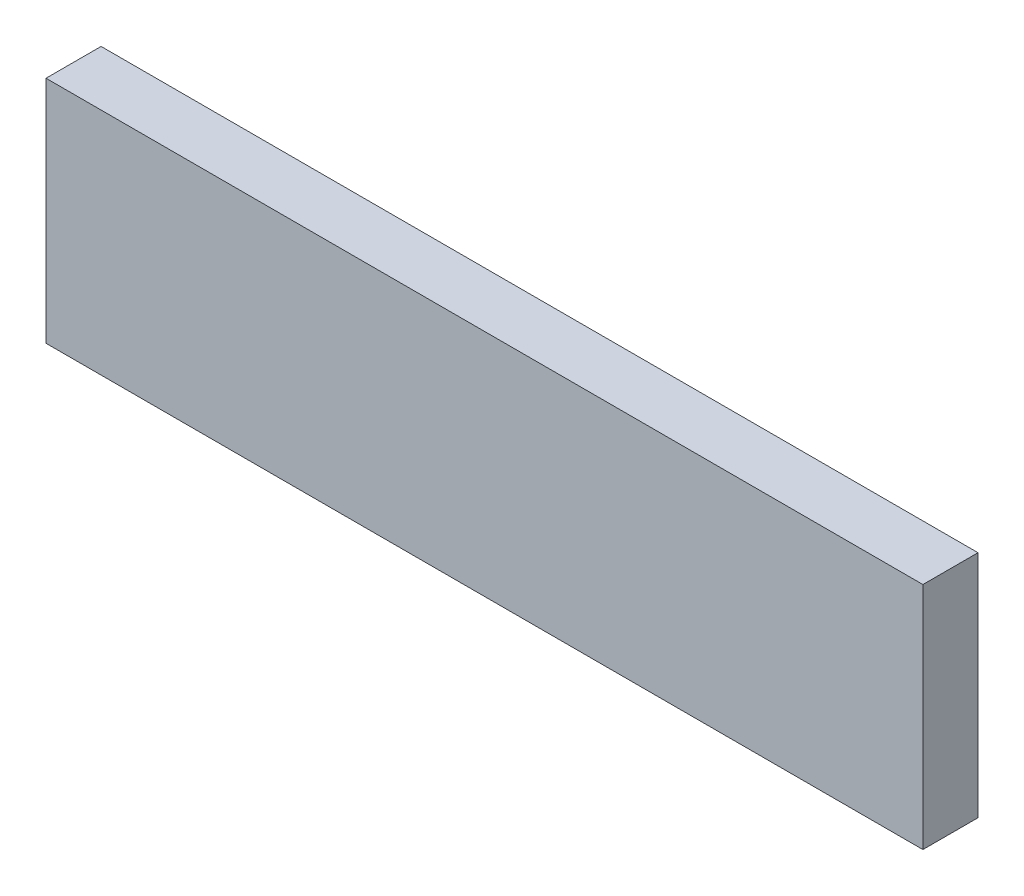
ISO-10303-21;
HEADER;
FILE_DESCRIPTION(('STEP AP214'),'2;1');
FILE_NAME('part.step','',(''),(''),'','','');
FILE_SCHEMA(('AUTOMOTIVE_DESIGN { 1 0 10303 214 1 1 1 1 }'));
ENDSEC;
DATA;
#1=APPLICATION_CONTEXT('core data for automotive mechanical design processes');
#2=APPLICATION_PROTOCOL_DEFINITION('international standard','automotive_design',2000,#1);
#3=PRODUCT_CONTEXT('',#1,'mechanical');
#4=PRODUCT('Part','Part','',(#3));
#5=PRODUCT_RELATED_PRODUCT_CATEGORY('part','',(#4));
#6=PRODUCT_DEFINITION_FORMATION('','',#4);
#7=PRODUCT_DEFINITION_CONTEXT('part definition',#1,'design');
#8=PRODUCT_DEFINITION('design','',#6,#7);
#9=PRODUCT_DEFINITION_SHAPE('','',#8);
#10=(LENGTH_UNIT() NAMED_UNIT(*) SI_UNIT(.MILLI.,.METRE.));
#11=(NAMED_UNIT(*) PLANE_ANGLE_UNIT() SI_UNIT($,.RADIAN.));
#12=(NAMED_UNIT(*) SI_UNIT($,.STERADIAN.) SOLID_ANGLE_UNIT());
#13=UNCERTAINTY_MEASURE_WITH_UNIT(LENGTH_MEASURE(1.E-05),#10,'distance_accuracy_value','');
#14=(GEOMETRIC_REPRESENTATION_CONTEXT(3) GLOBAL_UNCERTAINTY_ASSIGNED_CONTEXT((#13)) GLOBAL_UNIT_ASSIGNED_CONTEXT((#10,
#11,#12)) REPRESENTATION_CONTEXT('',''));
#15=CARTESIAN_POINT('',(0.,0.,0.));
#16=DIRECTION('',(0.,0.,1.));
#17=DIRECTION('',(1.,0.,0.));
#18=AXIS2_PLACEMENT_3D('',#15,#16,#17);
#19=CARTESIAN_POINT('',(95.5,25.,6.));
#20=DIRECTION('',(-1.,0.,0.));
#21=DIRECTION('',(0.,0.,1.));
#22=AXIS2_PLACEMENT_3D('',#19,#20,#21);
#23=PLANE('',#22);
#24=DIRECTION('',(0.,1.,0.));
#25=VECTOR('',#24,1.);
#26=CARTESIAN_POINT('',(95.5,25.,-6.));
#27=LINE('',#26,#25);
#28=CARTESIAN_POINT('',(95.5,-25.,-6.));
#29=VERTEX_POINT('',#28);
#30=CARTESIAN_POINT('',(95.5,25.,-6.));
#31=VERTEX_POINT('',#30);
#32=EDGE_CURVE('E98',#29,#31,#27,.T.);
#33=ORIENTED_EDGE('',*,*,#32,.T.);
#34=DIRECTION('',(0.,0.,-1.));
#35=VECTOR('',#34,1.);
#36=CARTESIAN_POINT('',(95.5,25.,6.));
#37=LINE('',#36,#35);
#38=CARTESIAN_POINT('',(95.5,25.,6.));
#39=VERTEX_POINT('',#38);
#40=EDGE_CURVE('E11',#39,#31,#37,.T.);
#41=ORIENTED_EDGE('',*,*,#40,.F.);
#42=DIRECTION('',(0.,1.,0.));
#43=VECTOR('',#42,1.);
#44=CARTESIAN_POINT('',(95.5,25.,6.));
#45=LINE('',#44,#43);
#46=CARTESIAN_POINT('',(95.5,-25.,6.));
#47=VERTEX_POINT('',#46);
#48=EDGE_CURVE('E86',#47,#39,#45,.T.);
#49=ORIENTED_EDGE('',*,*,#48,.F.);
#50=DIRECTION('',(0.,0.,-1.));
#51=VECTOR('',#50,1.);
#52=CARTESIAN_POINT('',(95.5,-25.,6.));
#53=LINE('',#52,#51);
#54=EDGE_CURVE('E94',#47,#29,#53,.T.);
#55=ORIENTED_EDGE('',*,*,#54,.T.);
#56=EDGE_LOOP('',(#33,#41,#49,#55));
#57=FACE_BOUND('',#56,.T.);
#58=ADVANCED_FACE('F35',(#57),#23,.F.);
#59=CARTESIAN_POINT('',(-95.5,25.,6.));
#60=DIRECTION('',(0.,-1.,0.));
#61=DIRECTION('',(1.,0.,0.));
#62=AXIS2_PLACEMENT_3D('',#59,#60,#61);
#63=PLANE('',#62);
#64=DIRECTION('',(-1.,0.,0.));
#65=VECTOR('',#64,1.);
#66=CARTESIAN_POINT('',(-95.5,25.,-6.));
#67=LINE('',#66,#65);
#68=CARTESIAN_POINT('',(-95.5,25.,-6.));
#69=VERTEX_POINT('',#68);
#70=EDGE_CURVE('E90',#31,#69,#67,.T.);
#71=ORIENTED_EDGE('',*,*,#70,.T.);
#72=DIRECTION('',(0.,0.,-1.));
#73=VECTOR('',#72,1.);
#74=CARTESIAN_POINT('',(-95.5,25.,6.));
#75=LINE('',#74,#73);
#76=CARTESIAN_POINT('',(-95.5,25.,6.));
#77=VERTEX_POINT('',#76);
#78=EDGE_CURVE('E43',#77,#69,#75,.T.);
#79=ORIENTED_EDGE('',*,*,#78,.F.);
#80=DIRECTION('',(-1.,0.,0.));
#81=VECTOR('',#80,1.);
#82=CARTESIAN_POINT('',(-95.5,25.,6.));
#83=LINE('',#82,#81);
#84=EDGE_CURVE('E81',#39,#77,#83,.T.);
#85=ORIENTED_EDGE('',*,*,#84,.F.);
#86=ORIENTED_EDGE('',*,*,#40,.T.);
#87=EDGE_LOOP('',(#71,#79,#85,#86));
#88=FACE_BOUND('',#87,.T.);
#89=ADVANCED_FACE('F89',(#88),#63,.F.);
#90=CARTESIAN_POINT('',(-95.5,25.,6.));
#91=DIRECTION('',(1.,0.,0.));
#92=DIRECTION('',(0.,1.,0.));
#93=AXIS2_PLACEMENT_3D('',#90,#91,#92);
#94=PLANE('',#93);
#95=DIRECTION('',(0.,-1.,0.));
#96=VECTOR('',#95,1.);
#97=CARTESIAN_POINT('',(-95.5,25.,-6.));
#98=LINE('',#97,#96);
#99=CARTESIAN_POINT('',(-95.5,-25.,-6.));
#100=VERTEX_POINT('',#99);
#101=EDGE_CURVE('E68',#69,#100,#98,.T.);
#102=ORIENTED_EDGE('',*,*,#101,.T.);
#103=DIRECTION('',(0.,0.,-1.));
#104=VECTOR('',#103,1.);
#105=CARTESIAN_POINT('',(-95.5,-25.,6.));
#106=LINE('',#105,#104);
#107=CARTESIAN_POINT('',(-95.5,-25.,6.));
#108=VERTEX_POINT('',#107);
#109=EDGE_CURVE('E91',#108,#100,#106,.T.);
#110=ORIENTED_EDGE('',*,*,#109,.F.);
#111=DIRECTION('',(0.,-1.,0.));
#112=VECTOR('',#111,1.);
#113=CARTESIAN_POINT('',(-95.5,25.,6.));
#114=LINE('',#113,#112);
#115=EDGE_CURVE('E84',#77,#108,#114,.T.);
#116=ORIENTED_EDGE('',*,*,#115,.F.);
#117=ORIENTED_EDGE('',*,*,#78,.T.);
#118=EDGE_LOOP('',(#102,#110,#116,#117));
#119=FACE_BOUND('',#118,.T.);
#120=ADVANCED_FACE('F92',(#119),#94,.F.);
#121=CARTESIAN_POINT('',(-95.5,-25.,6.));
#122=DIRECTION('',(0.,1.,0.));
#123=DIRECTION('',(0.,0.,1.));
#124=AXIS2_PLACEMENT_3D('',#121,#122,#123);
#125=PLANE('',#124);
#126=CARTESIAN_POINT('',(75.,-25.,0.));
#127=DIRECTION('',(0.,-1.,0.));
#128=DIRECTION('',(0.,0.,-1.));
#129=AXIS2_PLACEMENT_3D('',#126,#127,#128);
#130=CIRCLE('',#129,2.99999999999999);
#131=CARTESIAN_POINT('',(75.,-25.,-2.99999999999999));
#132=VERTEX_POINT('',#131);
#133=EDGE_CURVE('E118',#132,#132,#130,.T.);
#134=ORIENTED_EDGE('',*,*,#133,.F.);
#135=EDGE_LOOP('',(#134));
#136=FACE_BOUND('',#135,.T.);
#137=CARTESIAN_POINT('',(-75.,-25.,0.));
#138=DIRECTION('',(0.,-1.,0.));
#139=DIRECTION('',(0.,0.,-1.));
#140=AXIS2_PLACEMENT_3D('',#137,#138,#139);
#141=CIRCLE('',#140,2.99999999999999);
#142=CARTESIAN_POINT('',(-75.,-25.,-2.99999999999999));
#143=VERTEX_POINT('',#142);
#144=EDGE_CURVE('E112',#143,#143,#141,.T.);
#145=ORIENTED_EDGE('',*,*,#144,.F.);
#146=EDGE_LOOP('',(#145));
#147=FACE_BOUND('',#146,.T.);
#148=DIRECTION('',(1.,0.,0.));
#149=VECTOR('',#148,1.);
#150=CARTESIAN_POINT('',(-95.5,-25.,-6.));
#151=LINE('',#150,#149);
#152=EDGE_CURVE('E74',#100,#29,#151,.T.);
#153=ORIENTED_EDGE('',*,*,#152,.T.);
#154=ORIENTED_EDGE('',*,*,#54,.F.);
#155=DIRECTION('',(1.,0.,0.));
#156=VECTOR('',#155,1.);
#157=CARTESIAN_POINT('',(-95.5,-25.,6.));
#158=LINE('',#157,#156);
#159=EDGE_CURVE('E51',#108,#47,#158,.T.);
#160=ORIENTED_EDGE('',*,*,#159,.F.);
#161=ORIENTED_EDGE('',*,*,#109,.T.);
#162=EDGE_LOOP('',(#153,#154,#160,#161));
#163=FACE_BOUND('',#162,.T.);
#164=ADVANCED_FACE('F106',(#136,#147,#163),#125,.F.);
#165=CARTESIAN_POINT('',(0.,0.,6.));
#166=DIRECTION('',(0.,0.,1.));
#167=DIRECTION('',(1.,0.,0.));
#168=AXIS2_PLACEMENT_3D('',#165,#166,#167);
#169=PLANE('',#168);
#170=ORIENTED_EDGE('',*,*,#48,.T.);
#171=ORIENTED_EDGE('',*,*,#84,.T.);
#172=ORIENTED_EDGE('',*,*,#115,.T.);
#173=ORIENTED_EDGE('',*,*,#159,.T.);
#174=EDGE_LOOP('',(#170,#171,#172,#173));
#175=FACE_BOUND('',#174,.T.);
#176=ADVANCED_FACE('F82',(#175),#169,.T.);
#177=CARTESIAN_POINT('',(0.,0.,-6.));
#178=DIRECTION('',(0.,0.,1.));
#179=DIRECTION('',(1.,0.,0.));
#180=AXIS2_PLACEMENT_3D('',#177,#178,#179);
#181=PLANE('',#180);
#182=ORIENTED_EDGE('',*,*,#32,.F.);
#183=ORIENTED_EDGE('',*,*,#152,.F.);
#184=ORIENTED_EDGE('',*,*,#101,.F.);
#185=ORIENTED_EDGE('',*,*,#70,.F.);
#186=EDGE_LOOP('',(#182,#183,#184,#185));
#187=FACE_BOUND('',#186,.T.);
#188=ADVANCED_FACE('F109',(#187),#181,.F.);
#189=CARTESIAN_POINT('',(-75.,-5.00000000000001,0.));
#190=DIRECTION('',(0.,-1.,0.));
#191=DIRECTION('',(0.,0.,-1.));
#192=AXIS2_PLACEMENT_3D('',#189,#190,#191);
#193=CYLINDRICAL_SURFACE('',#192,2.99999999999999);
#194=CARTESIAN_POINT('',(-75.,-5.00000000000001,0.));
#195=DIRECTION('',(0.,-1.,0.));
#196=DIRECTION('',(0.,0.,-1.));
#197=AXIS2_PLACEMENT_3D('',#194,#195,#196);
#198=CIRCLE('',#197,2.99999999999999);
#199=CARTESIAN_POINT('',(-75.,-5.00000000000001,-2.99999999999999));
#200=VERTEX_POINT('',#199);
#201=EDGE_CURVE('E101',#200,#200,#198,.T.);
#202=ORIENTED_EDGE('',*,*,#201,.F.);
#203=EDGE_LOOP('',(#202));
#204=FACE_BOUND('',#203,.T.);
#205=ORIENTED_EDGE('',*,*,#144,.T.);
#206=EDGE_LOOP('',(#205));
#207=FACE_BOUND('',#206,.T.);
#208=ADVANCED_FACE('F138',(#204,#207),#193,.F.);
#209=CARTESIAN_POINT('',(-75.,-5.00000000000001,0.));
#210=DIRECTION('',(0.,-1.,0.));
#211=DIRECTION('',(0.,0.,-1.));
#212=AXIS2_PLACEMENT_3D('',#209,#210,#211);
#213=PLANE('',#212);
#214=ORIENTED_EDGE('',*,*,#201,.T.);
#215=EDGE_LOOP('',(#214));
#216=FACE_BOUND('',#215,.T.);
#217=ADVANCED_FACE('F129',(#216),#213,.T.);
#218=CARTESIAN_POINT('',(75.,-5.00000000000001,0.));
#219=DIRECTION('',(0.,-1.,0.));
#220=DIRECTION('',(0.,0.,-1.));
#221=AXIS2_PLACEMENT_3D('',#218,#219,#220);
#222=CYLINDRICAL_SURFACE('',#221,2.99999999999999);
#223=CARTESIAN_POINT('',(75.,-5.00000000000001,0.));
#224=DIRECTION('',(0.,-1.,0.));
#225=DIRECTION('',(0.,0.,-1.));
#226=AXIS2_PLACEMENT_3D('',#223,#224,#225);
#227=CIRCLE('',#226,2.99999999999999);
#228=CARTESIAN_POINT('',(75.,-5.00000000000001,-2.99999999999999));
#229=VERTEX_POINT('',#228);
#230=EDGE_CURVE('E115',#229,#229,#227,.T.);
#231=ORIENTED_EDGE('',*,*,#230,.F.);
#232=EDGE_LOOP('',(#231));
#233=FACE_BOUND('',#232,.T.);
#234=ORIENTED_EDGE('',*,*,#133,.T.);
#235=EDGE_LOOP('',(#234));
#236=FACE_BOUND('',#235,.T.);
#237=ADVANCED_FACE('F126',(#233,#236),#222,.F.);
#238=CARTESIAN_POINT('',(75.,-5.00000000000001,0.));
#239=DIRECTION('',(0.,-1.,0.));
#240=DIRECTION('',(0.,0.,-1.));
#241=AXIS2_PLACEMENT_3D('',#238,#239,#240);
#242=PLANE('',#241);
#243=ORIENTED_EDGE('',*,*,#230,.T.);
#244=EDGE_LOOP('',(#243));
#245=FACE_BOUND('',#244,.T.);
#246=ADVANCED_FACE('F124',(#245),#242,.T.);
#247=CLOSED_SHELL('',(#58,#89,#120,#164,#176,#188,#208,#217,#237,#246));
#248=MANIFOLD_SOLID_BREP('B2',#247);
#249=ADVANCED_BREP_SHAPE_REPRESENTATION('',(#18,#248),#14);
#250=SHAPE_DEFINITION_REPRESENTATION(#9,#249);
ENDSEC;
END-ISO-10303-21;
